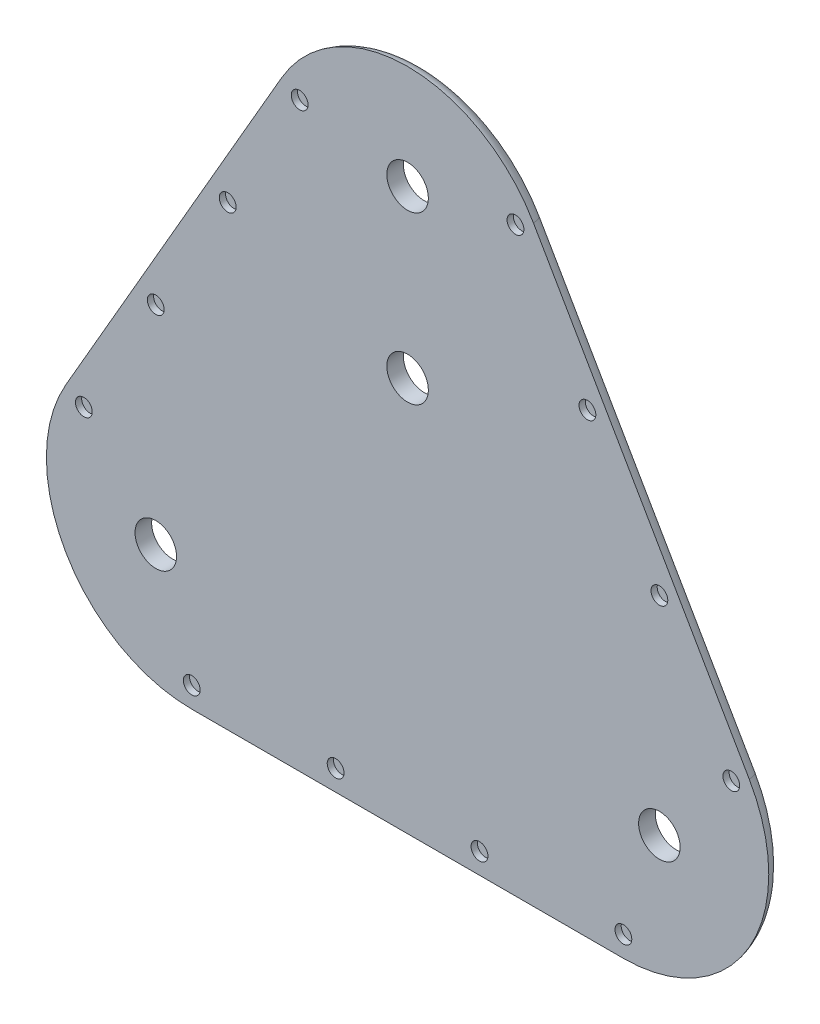
ISO-10303-21;
HEADER;
FILE_DESCRIPTION(('STEP AP214'),'2;1');
FILE_NAME('part.step','',(''),(''),'','','');
FILE_SCHEMA(('AUTOMOTIVE_DESIGN { 1 0 10303 214 1 1 1 1 }'));
ENDSEC;
DATA;
#1=APPLICATION_CONTEXT('core data for automotive mechanical design processes');
#2=APPLICATION_PROTOCOL_DEFINITION('international standard','automotive_design',2000,#1);
#3=PRODUCT_CONTEXT('',#1,'mechanical');
#4=PRODUCT('Part','Part','',(#3));
#5=PRODUCT_RELATED_PRODUCT_CATEGORY('part','',(#4));
#6=PRODUCT_DEFINITION_FORMATION('','',#4);
#7=PRODUCT_DEFINITION_CONTEXT('part definition',#1,'design');
#8=PRODUCT_DEFINITION('design','',#6,#7);
#9=PRODUCT_DEFINITION_SHAPE('','',#8);
#10=(LENGTH_UNIT() NAMED_UNIT(*) SI_UNIT(.MILLI.,.METRE.));
#11=(NAMED_UNIT(*) PLANE_ANGLE_UNIT() SI_UNIT($,.RADIAN.));
#12=(NAMED_UNIT(*) SI_UNIT($,.STERADIAN.) SOLID_ANGLE_UNIT());
#13=UNCERTAINTY_MEASURE_WITH_UNIT(LENGTH_MEASURE(1.E-05),#10,'distance_accuracy_value','');
#14=(GEOMETRIC_REPRESENTATION_CONTEXT(3) GLOBAL_UNCERTAINTY_ASSIGNED_CONTEXT((#13)) GLOBAL_UNIT_ASSIGNED_CONTEXT((#10,
#11,#12)) REPRESENTATION_CONTEXT('',''));
#15=CARTESIAN_POINT('',(0.,0.,0.));
#16=DIRECTION('',(0.,0.,1.));
#17=DIRECTION('',(1.,0.,0.));
#18=AXIS2_PLACEMENT_3D('',#15,#16,#17);
#19=CARTESIAN_POINT('',(0.,60.,4.));
#20=DIRECTION('',(0.,0.,1.));
#21=DIRECTION('',(1.,0.,0.));
#22=AXIS2_PLACEMENT_3D('',#19,#20,#21);
#23=PLANE('',#22);
#24=CARTESIAN_POINT('',(-77.9422863405994,-15.0000000000003,4.));
#25=DIRECTION('',(0.,0.,1.));
#26=DIRECTION('',(1.,0.,0.));
#27=AXIS2_PLACEMENT_3D('',#24,#25,#26);
#28=CIRCLE('',#27,2.025);
#29=CARTESIAN_POINT('',(-75.9172863405994,-15.0000000000003,4.));
#30=VERTEX_POINT('',#29);
#31=EDGE_CURVE('E216',#30,#30,#28,.T.);
#32=ORIENTED_EDGE('',*,*,#31,.F.);
#33=EDGE_LOOP('',(#32));
#34=FACE_BOUND('',#33,.T.);
#35=CARTESIAN_POINT('',(51.958475772934,-60.0000000000003,4.));
#36=DIRECTION('',(0.,0.,1.));
#37=DIRECTION('',(1.,0.,0.));
#38=AXIS2_PLACEMENT_3D('',#35,#36,#37);
#39=CIRCLE('',#38,2.025);
#40=CARTESIAN_POINT('',(53.983475772934,-60.0000000000003,4.));
#41=VERTEX_POINT('',#40);
#42=EDGE_CURVE('E165',#41,#41,#39,.T.);
#43=ORIENTED_EDGE('',*,*,#42,.F.);
#44=EDGE_LOOP('',(#43));
#45=FACE_BOUND('',#44,.T.);
#46=CARTESIAN_POINT('',(17.318475772934,-60.0000000000003,4.));
#47=DIRECTION('',(0.,0.,1.));
#48=DIRECTION('',(1.,0.,0.));
#49=AXIS2_PLACEMENT_3D('',#46,#47,#48);
#50=CIRCLE('',#49,2.025);
#51=CARTESIAN_POINT('',(19.343475772934,-60.0000000000003,4.));
#52=VERTEX_POINT('',#51);
#53=EDGE_CURVE('E174',#52,#52,#50,.T.);
#54=ORIENTED_EDGE('',*,*,#53,.F.);
#55=EDGE_LOOP('',(#54));
#56=FACE_BOUND('',#55,.T.);
#57=CARTESIAN_POINT('',(-17.321524227066,-60.0000000000002,4.));
#58=DIRECTION('',(0.,0.,1.));
#59=DIRECTION('',(1.,0.,0.));
#60=AXIS2_PLACEMENT_3D('',#57,#58,#59);
#61=CIRCLE('',#60,2.025);
#62=CARTESIAN_POINT('',(-15.296524227066,-60.0000000000002,4.));
#63=VERTEX_POINT('',#62);
#64=EDGE_CURVE('E450',#63,#63,#61,.T.);
#65=ORIENTED_EDGE('',*,*,#64,.F.);
#66=EDGE_LOOP('',(#65));
#67=FACE_BOUND('',#66,.T.);
#68=CARTESIAN_POINT('',(-51.961524227066,-60.0000000000002,4.));
#69=DIRECTION('',(0.,0.,1.));
#70=DIRECTION('',(1.,0.,0.));
#71=AXIS2_PLACEMENT_3D('',#68,#69,#70);
#72=CIRCLE('',#71,2.025);
#73=CARTESIAN_POINT('',(-49.936524227066,-60.0000000000002,4.));
#74=VERTEX_POINT('',#73);
#75=EDGE_CURVE('E217',#74,#74,#72,.T.);
#76=ORIENTED_EDGE('',*,*,#75,.F.);
#77=EDGE_LOOP('',(#76));
#78=FACE_BOUND('',#77,.T.);
#79=CARTESIAN_POINT('',(77.9422863405997,-14.9999999999994,4.));
#80=DIRECTION('',(0.,0.,1.));
#81=DIRECTION('',(1.,0.,0.));
#82=AXIS2_PLACEMENT_3D('',#79,#80,#81);
#83=CIRCLE('',#82,2.02499999999999);
#84=CARTESIAN_POINT('',(79.9672863405997,-14.9999999999994,4.));
#85=VERTEX_POINT('',#84);
#86=EDGE_CURVE('E225',#85,#85,#83,.T.);
#87=ORIENTED_EDGE('',*,*,#86,.F.);
#88=EDGE_LOOP('',(#87));
#89=FACE_BOUND('',#88,.T.);
#90=CARTESIAN_POINT('',(-60.6222863405994,14.9991199870927,4.));
#91=DIRECTION('',(0.,0.,1.));
#92=DIRECTION('',(1.,0.,0.));
#93=AXIS2_PLACEMENT_3D('',#90,#91,#92);
#94=CIRCLE('',#93,2.025);
#95=CARTESIAN_POINT('',(-58.5972863405994,14.9991199870927,4.));
#96=VERTEX_POINT('',#95);
#97=EDGE_CURVE('E233',#96,#96,#94,.T.);
#98=ORIENTED_EDGE('',*,*,#97,.F.);
#99=EDGE_LOOP('',(#98));
#100=FACE_BOUND('',#99,.T.);
#101=CARTESIAN_POINT('',(-43.3022863405995,44.9982399741857,4.));
#102=DIRECTION('',(0.,0.,1.));
#103=DIRECTION('',(1.,0.,0.));
#104=AXIS2_PLACEMENT_3D('',#101,#102,#103);
#105=CIRCLE('',#104,2.02499999999999);
#106=CARTESIAN_POINT('',(-41.2772863405995,44.9982399741857,4.));
#107=VERTEX_POINT('',#106);
#108=EDGE_CURVE('E200',#107,#107,#105,.T.);
#109=ORIENTED_EDGE('',*,*,#108,.F.);
#110=EDGE_LOOP('',(#109));
#111=FACE_BOUND('',#110,.T.);
#112=CARTESIAN_POINT('',(25.9822863405993,74.9973599612792,4.));
#113=DIRECTION('',(0.,0.,1.));
#114=DIRECTION('',(1.,0.,0.));
#115=AXIS2_PLACEMENT_3D('',#112,#113,#114);
#116=CIRCLE('',#115,2.02499999999999);
#117=CARTESIAN_POINT('',(28.0072863405993,74.9973599612792,4.));
#118=VERTEX_POINT('',#117);
#119=EDGE_CURVE('E191',#118,#118,#116,.T.);
#120=ORIENTED_EDGE('',*,*,#119,.F.);
#121=EDGE_LOOP('',(#120));
#122=FACE_BOUND('',#121,.T.);
#123=CARTESIAN_POINT('',(43.3022863405994,44.9982399741863,4.));
#124=DIRECTION('',(0.,0.,1.));
#125=DIRECTION('',(1.,0.,0.));
#126=AXIS2_PLACEMENT_3D('',#123,#124,#125);
#127=CIRCLE('',#126,2.02499999999999);
#128=CARTESIAN_POINT('',(45.3272863405994,44.9982399741863,4.));
#129=VERTEX_POINT('',#128);
#130=EDGE_CURVE('E183',#129,#129,#127,.T.);
#131=ORIENTED_EDGE('',*,*,#130,.F.);
#132=EDGE_LOOP('',(#131));
#133=FACE_BOUND('',#132,.T.);
#134=CARTESIAN_POINT('',(60.6222863405996,14.9991199870935,4.));
#135=DIRECTION('',(0.,0.,1.));
#136=DIRECTION('',(1.,0.,0.));
#137=AXIS2_PLACEMENT_3D('',#134,#135,#136);
#138=CIRCLE('',#137,2.02499999999999);
#139=CARTESIAN_POINT('',(62.6472863405996,14.9991199870935,4.));
#140=VERTEX_POINT('',#139);
#141=EDGE_CURVE('E182',#140,#140,#138,.T.);
#142=ORIENTED_EDGE('',*,*,#141,.F.);
#143=EDGE_LOOP('',(#142));
#144=FACE_BOUND('',#143,.T.);
#145=CARTESIAN_POINT('',(-25.9822863405996,74.9973599612787,4.));
#146=DIRECTION('',(0.,0.,1.));
#147=DIRECTION('',(1.,0.,0.));
#148=AXIS2_PLACEMENT_3D('',#145,#146,#147);
#149=CIRCLE('',#148,2.02499999999999);
#150=CARTESIAN_POINT('',(-23.9572863405996,74.9973599612787,4.));
#151=VERTEX_POINT('',#150);
#152=EDGE_CURVE('E201',#151,#151,#149,.T.);
#153=ORIENTED_EDGE('',*,*,#152,.F.);
#154=EDGE_LOOP('',(#153));
#155=FACE_BOUND('',#154,.T.);
#156=CARTESIAN_POINT('',(0.,70.,4.));
#157=DIRECTION('',(0.,0.,1.));
#158=DIRECTION('',(1.,0.,0.));
#159=AXIS2_PLACEMENT_3D('',#156,#157,#158);
#160=CIRCLE('',#159,5.);
#161=CARTESIAN_POINT('',(5.,70.,4.));
#162=VERTEX_POINT('',#161);
#163=EDGE_CURVE('E111',#162,#162,#160,.T.);
#164=ORIENTED_EDGE('',*,*,#163,.F.);
#165=EDGE_LOOP('',(#164));
#166=FACE_BOUND('',#165,.T.);
#167=CARTESIAN_POINT('',(0.,30.,4.));
#168=DIRECTION('',(0.,0.,1.));
#169=DIRECTION('',(1.,0.,0.));
#170=AXIS2_PLACEMENT_3D('',#167,#168,#169);
#171=CIRCLE('',#170,5.);
#172=CARTESIAN_POINT('',(5.,30.,4.));
#173=VERTEX_POINT('',#172);
#174=EDGE_CURVE('E248',#173,#173,#171,.T.);
#175=ORIENTED_EDGE('',*,*,#174,.F.);
#176=EDGE_LOOP('',(#175));
#177=FACE_BOUND('',#176,.T.);
#178=CARTESIAN_POINT('',(60.6217782649152,-34.9999999999974,4.));
#179=DIRECTION('',(0.,0.,1.));
#180=DIRECTION('',(1.,0.,0.));
#181=AXIS2_PLACEMENT_3D('',#178,#179,#180);
#182=CIRCLE('',#181,5.00000000000382);
#183=CARTESIAN_POINT('',(65.621778264919,-34.9999999999974,4.));
#184=VERTEX_POINT('',#183);
#185=EDGE_CURVE('E256',#184,#184,#182,.T.);
#186=ORIENTED_EDGE('',*,*,#185,.F.);
#187=EDGE_LOOP('',(#186));
#188=FACE_BOUND('',#187,.T.);
#189=CARTESIAN_POINT('',(-60.6217782649063,-35.0000000000026,4.));
#190=DIRECTION('',(0.,0.,1.));
#191=DIRECTION('',(1.,0.,0.));
#192=AXIS2_PLACEMENT_3D('',#189,#190,#191);
#193=CIRCLE('',#192,5.00000000000564);
#194=CARTESIAN_POINT('',(-55.6217782649006,-35.0000000000026,4.));
#195=VERTEX_POINT('',#194);
#196=EDGE_CURVE('E264',#195,#195,#193,.T.);
#197=ORIENTED_EDGE('',*,*,#196,.F.);
#198=EDGE_LOOP('',(#197));
#199=FACE_BOUND('',#198,.T.);
#200=CARTESIAN_POINT('',(0.,60.,4.));
#201=DIRECTION('',(0.,0.,1.));
#202=DIRECTION('',(1.,0.,0.));
#203=AXIS2_PLACEMENT_3D('',#200,#201,#202);
#204=CIRCLE('',#203,35.);
#205=CARTESIAN_POINT('',(30.3108891324553,77.5000000000001,4.));
#206=VERTEX_POINT('',#205);
#207=CARTESIAN_POINT('',(-30.3108891324554,77.4999999999999,4.));
#208=VERTEX_POINT('',#207);
#209=EDGE_CURVE('E100',#206,#208,#204,.T.);
#210=ORIENTED_EDGE('',*,*,#209,.T.);
#211=DIRECTION('',(-0.499999999999998,-0.86602540378444,0.));
#212=VECTOR('',#211,1.);
#213=CARTESIAN_POINT('',(-30.3108891324554,77.4999999999999,4.));
#214=LINE('',#213,#212);
#215=CARTESIAN_POINT('',(-82.2724133595216,-12.5000000000003,4.));
#216=VERTEX_POINT('',#215);
#217=EDGE_CURVE('E104',#208,#216,#214,.T.);
#218=ORIENTED_EDGE('',*,*,#217,.T.);
#219=CARTESIAN_POINT('',(-51.9615242270662,-30.0000000000002,4.));
#220=DIRECTION('',(0.,0.,1.));
#221=DIRECTION('',(1.,0.,0.));
#222=AXIS2_PLACEMENT_3D('',#219,#220,#221);
#223=CIRCLE('',#222,35.);
#224=CARTESIAN_POINT('',(-51.9615242270659,-65.0000000000003,4.));
#225=VERTEX_POINT('',#224);
#226=EDGE_CURVE('E124',#216,#225,#223,.T.);
#227=ORIENTED_EDGE('',*,*,#226,.T.);
#228=DIRECTION('',(1.,0.,0.));
#229=VECTOR('',#228,1.);
#230=CARTESIAN_POINT('',(-51.9615242270659,-65.0000000000003,4.));
#231=LINE('',#230,#229);
#232=CARTESIAN_POINT('',(51.9615242270668,-64.9999999999995,4.));
#233=VERTEX_POINT('',#232);
#234=EDGE_CURVE('E127',#225,#233,#231,.T.);
#235=ORIENTED_EDGE('',*,*,#234,.T.);
#236=CARTESIAN_POINT('',(51.9615242270666,-29.9999999999995,4.));
#237=DIRECTION('',(0.,0.,1.));
#238=DIRECTION('',(1.,0.,0.));
#239=AXIS2_PLACEMENT_3D('',#236,#237,#238);
#240=CIRCLE('',#239,35.);
#241=CARTESIAN_POINT('',(82.2724133595219,-12.4999999999994,4.));
#242=VERTEX_POINT('',#241);
#243=EDGE_CURVE('E133',#233,#242,#240,.T.);
#244=ORIENTED_EDGE('',*,*,#243,.T.);
#245=DIRECTION('',(-0.500000000000004,0.866025403784436,0.));
#246=VECTOR('',#245,1.);
#247=CARTESIAN_POINT('',(82.2724133595219,-12.4999999999994,4.));
#248=LINE('',#247,#246);
#249=EDGE_CURVE('E106',#242,#206,#248,.T.);
#250=ORIENTED_EDGE('',*,*,#249,.T.);
#251=EDGE_LOOP('',(#210,#218,#227,#235,#244,#250));
#252=FACE_BOUND('',#251,.T.);
#253=ADVANCED_FACE('F45',(#34,#45,#56,#67,#78,#89,#100,#111,#122,#133,#144,#155,#166,#177,#188,
#199,#252),#23,.T.);
#254=CARTESIAN_POINT('',(0.,60.,0.));
#255=DIRECTION('',(0.,0.,1.));
#256=DIRECTION('',(1.,0.,0.));
#257=AXIS2_PLACEMENT_3D('',#254,#255,#256);
#258=PLANE('',#257);
#259=DIRECTION('',(1.,0.,0.));
#260=VECTOR('',#259,1.);
#261=CARTESIAN_POINT('',(8.3398532044332E-13,-60.1010205144335,0.));
#262=LINE('',#261,#260);
#263=CARTESIAN_POINT('',(51.9615242270668,-60.1010205144332,0.));
#264=VERTEX_POINT('',#263);
#265=CARTESIAN_POINT('',(-51.961524227066,-60.1010205144339,0.));
#266=VERTEX_POINT('',#265);
#267=EDGE_CURVE('E138',#264,#266,#262,.F.);
#268=ORIENTED_EDGE('',*,*,#267,.T.);
#269=CARTESIAN_POINT('',(-51.9615242270662,-30.0000000000002,0.));
#270=DIRECTION('',(0.,0.,1.));
#271=DIRECTION('',(1.,0.,0.));
#272=AXIS2_PLACEMENT_3D('',#269,#270,#271);
#273=CIRCLE('',#272,30.1010205144336);
#274=CARTESIAN_POINT('',(-78.0297726724023,-14.9494897427835,0.));
#275=VERTEX_POINT('',#274);
#276=EDGE_CURVE('E11',#266,#275,#273,.F.);
#277=ORIENTED_EDGE('',*,*,#276,.T.);
#278=DIRECTION('',(-0.499999999999998,-0.86602540378444,0.));
#279=VECTOR('',#278,1.);
#280=CARTESIAN_POINT('',(-26.0682484453361,75.0505102572168,0.));
#281=LINE('',#280,#279);
#282=CARTESIAN_POINT('',(-26.0682484453361,75.0505102572168,0.));
#283=VERTEX_POINT('',#282);
#284=EDGE_CURVE('E55',#275,#283,#281,.F.);
#285=ORIENTED_EDGE('',*,*,#284,.T.);
#286=CARTESIAN_POINT('',(0.,60.,0.));
#287=DIRECTION('',(0.,0.,1.));
#288=DIRECTION('',(1.,0.,0.));
#289=AXIS2_PLACEMENT_3D('',#286,#287,#288);
#290=CIRCLE('',#289,30.1010205144336);
#291=CARTESIAN_POINT('',(26.068248445336,75.0505102572169,0.));
#292=VERTEX_POINT('',#291);
#293=EDGE_CURVE('E116',#283,#292,#290,.F.);
#294=ORIENTED_EDGE('',*,*,#293,.T.);
#295=DIRECTION('',(-0.500000000000004,0.866025403784436,0.));
#296=VECTOR('',#295,1.);
#297=CARTESIAN_POINT('',(26.068248445336,75.0505102572169,0.));
#298=LINE('',#297,#296);
#299=CARTESIAN_POINT('',(78.0297726724026,-14.9494897427826,0.));
#300=VERTEX_POINT('',#299);
#301=EDGE_CURVE('E144',#292,#300,#298,.F.);
#302=ORIENTED_EDGE('',*,*,#301,.T.);
#303=CARTESIAN_POINT('',(51.9615242270666,-29.9999999999995,0.));
#304=DIRECTION('',(0.,0.,1.));
#305=DIRECTION('',(1.,0.,0.));
#306=AXIS2_PLACEMENT_3D('',#303,#304,#305);
#307=CIRCLE('',#306,30.1010205144337);
#308=EDGE_CURVE('E141',#300,#264,#307,.F.);
#309=ORIENTED_EDGE('',*,*,#308,.T.);
#310=EDGE_LOOP('',(#268,#277,#285,#294,#302,#309));
#311=FACE_BOUND('',#310,.T.);
#312=CARTESIAN_POINT('',(0.,70.,0.));
#313=DIRECTION('',(0.,0.,1.));
#314=DIRECTION('',(1.,0.,0.));
#315=AXIS2_PLACEMENT_3D('',#312,#313,#314);
#316=CIRCLE('',#315,5.);
#317=CARTESIAN_POINT('',(5.,70.,0.));
#318=VERTEX_POINT('',#317);
#319=EDGE_CURVE('E244',#318,#318,#316,.T.);
#320=ORIENTED_EDGE('',*,*,#319,.T.);
#321=EDGE_LOOP('',(#320));
#322=FACE_BOUND('',#321,.T.);
#323=CARTESIAN_POINT('',(0.,30.,0.));
#324=DIRECTION('',(0.,0.,1.));
#325=DIRECTION('',(1.,0.,0.));
#326=AXIS2_PLACEMENT_3D('',#323,#324,#325);
#327=CIRCLE('',#326,5.);
#328=CARTESIAN_POINT('',(5.,30.,0.));
#329=VERTEX_POINT('',#328);
#330=EDGE_CURVE('E252',#329,#329,#327,.T.);
#331=ORIENTED_EDGE('',*,*,#330,.T.);
#332=EDGE_LOOP('',(#331));
#333=FACE_BOUND('',#332,.T.);
#334=CARTESIAN_POINT('',(60.6217782649152,-34.9999999999974,0.));
#335=DIRECTION('',(0.,0.,1.));
#336=DIRECTION('',(1.,0.,0.));
#337=AXIS2_PLACEMENT_3D('',#334,#335,#336);
#338=CIRCLE('',#337,5.00000000000382);
#339=CARTESIAN_POINT('',(65.621778264919,-34.9999999999974,0.));
#340=VERTEX_POINT('',#339);
#341=EDGE_CURVE('E260',#340,#340,#338,.T.);
#342=ORIENTED_EDGE('',*,*,#341,.T.);
#343=EDGE_LOOP('',(#342));
#344=FACE_BOUND('',#343,.T.);
#345=CARTESIAN_POINT('',(-60.6217782649063,-35.0000000000026,0.));
#346=DIRECTION('',(0.,0.,1.));
#347=DIRECTION('',(1.,0.,0.));
#348=AXIS2_PLACEMENT_3D('',#345,#346,#347);
#349=CIRCLE('',#348,5.00000000000564);
#350=CARTESIAN_POINT('',(-55.6217782649006,-35.0000000000026,0.));
#351=VERTEX_POINT('',#350);
#352=EDGE_CURVE('E268',#351,#351,#349,.T.);
#353=ORIENTED_EDGE('',*,*,#352,.T.);
#354=EDGE_LOOP('',(#353));
#355=FACE_BOUND('',#354,.T.);
#356=ADVANCED_FACE('F279',(#311,#322,#333,#344,#355),#258,.F.);
#357=CARTESIAN_POINT('',(-60.6217782649063,-35.0000000000026,18.1421356237469));
#358=DIRECTION('',(0.,0.,-1.));
#359=DIRECTION('',(-1.,0.,0.));
#360=AXIS2_PLACEMENT_3D('',#357,#358,#359);
#361=CYLINDRICAL_SURFACE('',#360,5.00000000000564);
#362=ORIENTED_EDGE('',*,*,#352,.F.);
#363=EDGE_LOOP('',(#362));
#364=FACE_BOUND('',#363,.T.);
#365=ORIENTED_EDGE('',*,*,#196,.T.);
#366=EDGE_LOOP('',(#365));
#367=FACE_BOUND('',#366,.T.);
#368=ADVANCED_FACE('F276',(#364,#367),#361,.F.);
#369=CARTESIAN_POINT('',(60.6217782649152,-34.9999999999974,18.1421356237469));
#370=DIRECTION('',(0.,0.,-1.));
#371=DIRECTION('',(-1.,0.,0.));
#372=AXIS2_PLACEMENT_3D('',#369,#370,#371);
#373=CYLINDRICAL_SURFACE('',#372,5.00000000000382);
#374=ORIENTED_EDGE('',*,*,#341,.F.);
#375=EDGE_LOOP('',(#374));
#376=FACE_BOUND('',#375,.T.);
#377=ORIENTED_EDGE('',*,*,#185,.T.);
#378=EDGE_LOOP('',(#377));
#379=FACE_BOUND('',#378,.T.);
#380=ADVANCED_FACE('F329',(#376,#379),#373,.F.);
#381=CARTESIAN_POINT('',(0.,30.,18.1421356237469));
#382=DIRECTION('',(0.,0.,-1.));
#383=DIRECTION('',(-1.,0.,0.));
#384=AXIS2_PLACEMENT_3D('',#381,#382,#383);
#385=CYLINDRICAL_SURFACE('',#384,5.);
#386=ORIENTED_EDGE('',*,*,#330,.F.);
#387=EDGE_LOOP('',(#386));
#388=FACE_BOUND('',#387,.T.);
#389=ORIENTED_EDGE('',*,*,#174,.T.);
#390=EDGE_LOOP('',(#389));
#391=FACE_BOUND('',#390,.T.);
#392=ADVANCED_FACE('F333',(#388,#391),#385,.F.);
#393=CARTESIAN_POINT('',(0.,70.,18.1421356237469));
#394=DIRECTION('',(0.,0.,-1.));
#395=DIRECTION('',(-1.,0.,0.));
#396=AXIS2_PLACEMENT_3D('',#393,#394,#395);
#397=CYLINDRICAL_SURFACE('',#396,5.);
#398=ORIENTED_EDGE('',*,*,#319,.F.);
#399=EDGE_LOOP('',(#398));
#400=FACE_BOUND('',#399,.T.);
#401=ORIENTED_EDGE('',*,*,#163,.T.);
#402=EDGE_LOOP('',(#401));
#403=FACE_BOUND('',#402,.T.);
#404=ADVANCED_FACE('F338',(#400,#403),#397,.F.);
#405=CARTESIAN_POINT('',(-25.9822863405996,74.9973599612787,2.5));
#406=DIRECTION('',(0.,0.,1.));
#407=DIRECTION('',(1.,0.,0.));
#408=AXIS2_PLACEMENT_3D('',#405,#406,#407);
#409=CYLINDRICAL_SURFACE('',#408,2.02499999999999);
#410=CARTESIAN_POINT('',(-25.9822863405996,74.9973599612787,2.5));
#411=DIRECTION('',(0.,0.,1.));
#412=DIRECTION('',(1.,0.,0.));
#413=AXIS2_PLACEMENT_3D('',#410,#411,#412);
#414=CIRCLE('',#413,2.02499999999999);
#415=CARTESIAN_POINT('',(-23.9572863405996,74.9973599612787,2.5));
#416=VERTEX_POINT('',#415);
#417=EDGE_CURVE('E196',#416,#416,#414,.T.);
#418=ORIENTED_EDGE('',*,*,#417,.F.);
#419=EDGE_LOOP('',(#418));
#420=FACE_BOUND('',#419,.T.);
#421=ORIENTED_EDGE('',*,*,#152,.T.);
#422=EDGE_LOOP('',(#421));
#423=FACE_BOUND('',#422,.T.);
#424=ADVANCED_FACE('F345',(#420,#423),#409,.F.);
#425=CARTESIAN_POINT('',(-25.9822863405996,74.9973599612787,2.5));
#426=DIRECTION('',(0.,0.,1.));
#427=DIRECTION('',(1.,0.,0.));
#428=AXIS2_PLACEMENT_3D('',#425,#426,#427);
#429=PLANE('',#428);
#430=ORIENTED_EDGE('',*,*,#417,.T.);
#431=EDGE_LOOP('',(#430));
#432=FACE_BOUND('',#431,.T.);
#433=ADVANCED_FACE('F385',(#432),#429,.T.);
#434=CARTESIAN_POINT('',(60.6222863405996,14.9991199870935,2.5));
#435=DIRECTION('',(0.,0.,1.));
#436=DIRECTION('',(1.,0.,0.));
#437=AXIS2_PLACEMENT_3D('',#434,#435,#436);
#438=CYLINDRICAL_SURFACE('',#437,2.02499999999999);
#439=CARTESIAN_POINT('',(60.6222863405996,14.9991199870935,2.5));
#440=DIRECTION('',(0.,0.,1.));
#441=DIRECTION('',(1.,0.,0.));
#442=AXIS2_PLACEMENT_3D('',#439,#440,#441);
#443=CIRCLE('',#442,2.02499999999999);
#444=CARTESIAN_POINT('',(62.6472863405996,14.9991199870935,2.5));
#445=VERTEX_POINT('',#444);
#446=EDGE_CURVE('E205',#445,#445,#443,.T.);
#447=ORIENTED_EDGE('',*,*,#446,.F.);
#448=EDGE_LOOP('',(#447));
#449=FACE_BOUND('',#448,.T.);
#450=ORIENTED_EDGE('',*,*,#141,.T.);
#451=EDGE_LOOP('',(#450));
#452=FACE_BOUND('',#451,.T.);
#453=ADVANCED_FACE('F381',(#449,#452),#438,.F.);
#454=CARTESIAN_POINT('',(60.6222863405996,14.9991199870935,2.5));
#455=DIRECTION('',(0.,0.,1.));
#456=DIRECTION('',(1.,0.,0.));
#457=AXIS2_PLACEMENT_3D('',#454,#455,#456);
#458=PLANE('',#457);
#459=ORIENTED_EDGE('',*,*,#446,.T.);
#460=EDGE_LOOP('',(#459));
#461=FACE_BOUND('',#460,.T.);
#462=ADVANCED_FACE('F384',(#461),#458,.T.);
#463=CARTESIAN_POINT('',(43.3022863405994,44.9982399741863,2.5));
#464=DIRECTION('',(0.,0.,1.));
#465=DIRECTION('',(1.,0.,0.));
#466=AXIS2_PLACEMENT_3D('',#463,#464,#465);
#467=CYLINDRICAL_SURFACE('',#466,2.02499999999999);
#468=CARTESIAN_POINT('',(43.3022863405994,44.9982399741863,2.5));
#469=DIRECTION('',(0.,0.,1.));
#470=DIRECTION('',(1.,0.,0.));
#471=AXIS2_PLACEMENT_3D('',#468,#469,#470);
#472=CIRCLE('',#471,2.02499999999999);
#473=CARTESIAN_POINT('',(45.3272863405994,44.9982399741863,2.5));
#474=VERTEX_POINT('',#473);
#475=EDGE_CURVE('E178',#474,#474,#472,.T.);
#476=ORIENTED_EDGE('',*,*,#475,.F.);
#477=EDGE_LOOP('',(#476));
#478=FACE_BOUND('',#477,.T.);
#479=ORIENTED_EDGE('',*,*,#130,.T.);
#480=EDGE_LOOP('',(#479));
#481=FACE_BOUND('',#480,.T.);
#482=ADVANCED_FACE('F389',(#478,#481),#467,.F.);
#483=CARTESIAN_POINT('',(43.3022863405994,44.9982399741863,2.5));
#484=DIRECTION('',(0.,0.,1.));
#485=DIRECTION('',(1.,0.,0.));
#486=AXIS2_PLACEMENT_3D('',#483,#484,#485);
#487=PLANE('',#486);
#488=ORIENTED_EDGE('',*,*,#475,.T.);
#489=EDGE_LOOP('',(#488));
#490=FACE_BOUND('',#489,.T.);
#491=ADVANCED_FACE('F400',(#490),#487,.T.);
#492=CARTESIAN_POINT('',(25.9822863405993,74.9973599612792,2.5));
#493=DIRECTION('',(0.,0.,1.));
#494=DIRECTION('',(1.,0.,0.));
#495=AXIS2_PLACEMENT_3D('',#492,#493,#494);
#496=CYLINDRICAL_SURFACE('',#495,2.02499999999999);
#497=CARTESIAN_POINT('',(25.9822863405993,74.9973599612792,2.5));
#498=DIRECTION('',(0.,0.,1.));
#499=DIRECTION('',(1.,0.,0.));
#500=AXIS2_PLACEMENT_3D('',#497,#498,#499);
#501=CIRCLE('',#500,2.02499999999999);
#502=CARTESIAN_POINT('',(28.0072863405993,74.9973599612792,2.5));
#503=VERTEX_POINT('',#502);
#504=EDGE_CURVE('E187',#503,#503,#501,.T.);
#505=ORIENTED_EDGE('',*,*,#504,.F.);
#506=EDGE_LOOP('',(#505));
#507=FACE_BOUND('',#506,.T.);
#508=ORIENTED_EDGE('',*,*,#119,.T.);
#509=EDGE_LOOP('',(#508));
#510=FACE_BOUND('',#509,.T.);
#511=ADVANCED_FACE('F397',(#507,#510),#496,.F.);
#512=CARTESIAN_POINT('',(25.9822863405993,74.9973599612792,2.5));
#513=DIRECTION('',(0.,0.,1.));
#514=DIRECTION('',(1.,0.,0.));
#515=AXIS2_PLACEMENT_3D('',#512,#513,#514);
#516=PLANE('',#515);
#517=ORIENTED_EDGE('',*,*,#504,.T.);
#518=EDGE_LOOP('',(#517));
#519=FACE_BOUND('',#518,.T.);
#520=ADVANCED_FACE('F351',(#519),#516,.T.);
#521=CARTESIAN_POINT('',(-43.3022863405995,44.9982399741857,2.5));
#522=DIRECTION('',(0.,0.,1.));
#523=DIRECTION('',(1.,0.,0.));
#524=AXIS2_PLACEMENT_3D('',#521,#522,#523);
#525=CYLINDRICAL_SURFACE('',#524,2.02499999999999);
#526=CARTESIAN_POINT('',(-43.3022863405995,44.9982399741857,2.5));
#527=DIRECTION('',(0.,0.,1.));
#528=DIRECTION('',(1.,0.,0.));
#529=AXIS2_PLACEMENT_3D('',#526,#527,#528);
#530=CIRCLE('',#529,2.02499999999999);
#531=CARTESIAN_POINT('',(-41.2772863405995,44.9982399741857,2.5));
#532=VERTEX_POINT('',#531);
#533=EDGE_CURVE('E237',#532,#532,#530,.T.);
#534=ORIENTED_EDGE('',*,*,#533,.F.);
#535=EDGE_LOOP('',(#534));
#536=FACE_BOUND('',#535,.T.);
#537=ORIENTED_EDGE('',*,*,#108,.T.);
#538=EDGE_LOOP('',(#537));
#539=FACE_BOUND('',#538,.T.);
#540=ADVANCED_FACE('F347',(#536,#539),#525,.F.);
#541=CARTESIAN_POINT('',(-43.3022863405995,44.9982399741857,2.5));
#542=DIRECTION('',(0.,0.,1.));
#543=DIRECTION('',(1.,0.,0.));
#544=AXIS2_PLACEMENT_3D('',#541,#542,#543);
#545=PLANE('',#544);
#546=ORIENTED_EDGE('',*,*,#533,.T.);
#547=EDGE_LOOP('',(#546));
#548=FACE_BOUND('',#547,.T.);
#549=ADVANCED_FACE('F350',(#548),#545,.T.);
#550=CARTESIAN_POINT('',(-60.6222863405994,14.9991199870927,2.5));
#551=DIRECTION('',(0.,0.,1.));
#552=DIRECTION('',(1.,0.,0.));
#553=AXIS2_PLACEMENT_3D('',#550,#551,#552);
#554=CYLINDRICAL_SURFACE('',#553,2.025);
#555=CARTESIAN_POINT('',(-60.6222863405994,14.9991199870927,2.5));
#556=DIRECTION('',(0.,0.,1.));
#557=DIRECTION('',(1.,0.,0.));
#558=AXIS2_PLACEMENT_3D('',#555,#556,#557);
#559=CIRCLE('',#558,2.025);
#560=CARTESIAN_POINT('',(-58.5972863405994,14.9991199870927,2.5));
#561=VERTEX_POINT('',#560);
#562=EDGE_CURVE('E229',#561,#561,#559,.T.);
#563=ORIENTED_EDGE('',*,*,#562,.F.);
#564=EDGE_LOOP('',(#563));
#565=FACE_BOUND('',#564,.T.);
#566=ORIENTED_EDGE('',*,*,#97,.T.);
#567=EDGE_LOOP('',(#566));
#568=FACE_BOUND('',#567,.T.);
#569=ADVANCED_FACE('F355',(#565,#568),#554,.F.);
#570=CARTESIAN_POINT('',(-60.6222863405994,14.9991199870927,2.5));
#571=DIRECTION('',(0.,0.,1.));
#572=DIRECTION('',(1.,0.,0.));
#573=AXIS2_PLACEMENT_3D('',#570,#571,#572);
#574=PLANE('',#573);
#575=ORIENTED_EDGE('',*,*,#562,.T.);
#576=EDGE_LOOP('',(#575));
#577=FACE_BOUND('',#576,.T.);
#578=ADVANCED_FACE('F359',(#577),#574,.T.);
#579=CARTESIAN_POINT('',(77.9422863405997,-14.9999999999994,2.5));
#580=DIRECTION('',(0.,0.,1.));
#581=DIRECTION('',(1.,0.,0.));
#582=AXIS2_PLACEMENT_3D('',#579,#580,#581);
#583=CYLINDRICAL_SURFACE('',#582,2.02499999999999);
#584=CARTESIAN_POINT('',(77.9422863405997,-14.9999999999994,2.5));
#585=DIRECTION('',(0.,0.,1.));
#586=DIRECTION('',(1.,0.,0.));
#587=AXIS2_PLACEMENT_3D('',#584,#585,#586);
#588=CIRCLE('',#587,2.02499999999999);
#589=CARTESIAN_POINT('',(79.9672863405997,-14.9999999999994,2.5));
#590=VERTEX_POINT('',#589);
#591=EDGE_CURVE('E221',#590,#590,#588,.T.);
#592=ORIENTED_EDGE('',*,*,#591,.F.);
#593=EDGE_LOOP('',(#592));
#594=FACE_BOUND('',#593,.T.);
#595=ORIENTED_EDGE('',*,*,#86,.T.);
#596=EDGE_LOOP('',(#595));
#597=FACE_BOUND('',#596,.T.);
#598=ADVANCED_FACE('F363',(#594,#597),#583,.F.);
#599=CARTESIAN_POINT('',(77.9422863405997,-14.9999999999994,2.5));
#600=DIRECTION('',(0.,0.,1.));
#601=DIRECTION('',(1.,0.,0.));
#602=AXIS2_PLACEMENT_3D('',#599,#600,#601);
#603=PLANE('',#602);
#604=ORIENTED_EDGE('',*,*,#591,.T.);
#605=EDGE_LOOP('',(#604));
#606=FACE_BOUND('',#605,.T.);
#607=ADVANCED_FACE('F367',(#606),#603,.T.);
#608=CARTESIAN_POINT('',(-51.961524227066,-60.0000000000002,2.5));
#609=DIRECTION('',(0.,0.,1.));
#610=DIRECTION('',(1.,0.,0.));
#611=AXIS2_PLACEMENT_3D('',#608,#609,#610);
#612=CYLINDRICAL_SURFACE('',#611,2.025);
#613=CARTESIAN_POINT('',(-51.961524227066,-60.0000000000002,2.5));
#614=DIRECTION('',(0.,0.,1.));
#615=DIRECTION('',(1.,0.,0.));
#616=AXIS2_PLACEMENT_3D('',#613,#614,#615);
#617=CIRCLE('',#616,2.025);
#618=CARTESIAN_POINT('',(-49.936524227066,-60.0000000000002,2.5));
#619=VERTEX_POINT('',#618);
#620=EDGE_CURVE('E212',#619,#619,#617,.T.);
#621=ORIENTED_EDGE('',*,*,#620,.F.);
#622=EDGE_LOOP('',(#621));
#623=FACE_BOUND('',#622,.T.);
#624=ORIENTED_EDGE('',*,*,#75,.T.);
#625=EDGE_LOOP('',(#624));
#626=FACE_BOUND('',#625,.T.);
#627=ADVANCED_FACE('F371',(#623,#626),#612,.F.);
#628=CARTESIAN_POINT('',(-51.961524227066,-60.0000000000002,2.5));
#629=DIRECTION('',(0.,0.,1.));
#630=DIRECTION('',(1.,0.,0.));
#631=AXIS2_PLACEMENT_3D('',#628,#629,#630);
#632=PLANE('',#631);
#633=ORIENTED_EDGE('',*,*,#620,.T.);
#634=EDGE_LOOP('',(#633));
#635=FACE_BOUND('',#634,.T.);
#636=ADVANCED_FACE('F375',(#635),#632,.T.);
#637=CARTESIAN_POINT('',(-17.321524227066,-60.0000000000002,2.5));
#638=DIRECTION('',(0.,0.,1.));
#639=DIRECTION('',(1.,0.,0.));
#640=AXIS2_PLACEMENT_3D('',#637,#638,#639);
#641=CYLINDRICAL_SURFACE('',#640,2.025);
#642=CARTESIAN_POINT('',(-17.321524227066,-60.0000000000002,2.5));
#643=DIRECTION('',(0.,0.,1.));
#644=DIRECTION('',(1.,0.,0.));
#645=AXIS2_PLACEMENT_3D('',#642,#643,#644);
#646=CIRCLE('',#645,2.025);
#647=CARTESIAN_POINT('',(-15.296524227066,-60.0000000000002,2.5));
#648=VERTEX_POINT('',#647);
#649=EDGE_CURVE('E195',#648,#648,#646,.T.);
#650=ORIENTED_EDGE('',*,*,#649,.F.);
#651=EDGE_LOOP('',(#650));
#652=FACE_BOUND('',#651,.T.);
#653=ORIENTED_EDGE('',*,*,#64,.T.);
#654=EDGE_LOOP('',(#653));
#655=FACE_BOUND('',#654,.T.);
#656=ADVANCED_FACE('F379',(#652,#655),#641,.F.);
#657=CARTESIAN_POINT('',(-17.321524227066,-60.0000000000002,2.5));
#658=DIRECTION('',(0.,0.,1.));
#659=DIRECTION('',(1.,0.,0.));
#660=AXIS2_PLACEMENT_3D('',#657,#658,#659);
#661=PLANE('',#660);
#662=ORIENTED_EDGE('',*,*,#649,.T.);
#663=EDGE_LOOP('',(#662));
#664=FACE_BOUND('',#663,.T.);
#665=ADVANCED_FACE('F423',(#664),#661,.T.);
#666=CARTESIAN_POINT('',(17.318475772934,-60.0000000000003,2.5));
#667=DIRECTION('',(0.,0.,1.));
#668=DIRECTION('',(1.,0.,0.));
#669=AXIS2_PLACEMENT_3D('',#666,#667,#668);
#670=CYLINDRICAL_SURFACE('',#669,2.025);
#671=CARTESIAN_POINT('',(17.318475772934,-60.0000000000003,2.5));
#672=DIRECTION('',(0.,0.,1.));
#673=DIRECTION('',(1.,0.,0.));
#674=AXIS2_PLACEMENT_3D('',#671,#672,#673);
#675=CIRCLE('',#674,2.025);
#676=CARTESIAN_POINT('',(19.343475772934,-60.0000000000003,2.5));
#677=VERTEX_POINT('',#676);
#678=EDGE_CURVE('E454',#677,#677,#675,.T.);
#679=ORIENTED_EDGE('',*,*,#678,.F.);
#680=EDGE_LOOP('',(#679));
#681=FACE_BOUND('',#680,.T.);
#682=ORIENTED_EDGE('',*,*,#53,.T.);
#683=EDGE_LOOP('',(#682));
#684=FACE_BOUND('',#683,.T.);
#685=ADVANCED_FACE('F420',(#681,#684),#670,.F.);
#686=CARTESIAN_POINT('',(17.318475772934,-60.0000000000003,2.5));
#687=DIRECTION('',(0.,0.,1.));
#688=DIRECTION('',(1.,0.,0.));
#689=AXIS2_PLACEMENT_3D('',#686,#687,#688);
#690=PLANE('',#689);
#691=ORIENTED_EDGE('',*,*,#678,.T.);
#692=EDGE_LOOP('',(#691));
#693=FACE_BOUND('',#692,.T.);
#694=ADVANCED_FACE('F415',(#693),#690,.T.);
#695=CARTESIAN_POINT('',(51.958475772934,-60.0000000000003,2.5));
#696=DIRECTION('',(0.,0.,1.));
#697=DIRECTION('',(1.,0.,0.));
#698=AXIS2_PLACEMENT_3D('',#695,#696,#697);
#699=CYLINDRICAL_SURFACE('',#698,2.025);
#700=CARTESIAN_POINT('',(51.958475772934,-60.0000000000003,2.5));
#701=DIRECTION('',(0.,0.,1.));
#702=DIRECTION('',(1.,0.,0.));
#703=AXIS2_PLACEMENT_3D('',#700,#701,#702);
#704=CIRCLE('',#703,2.025);
#705=CARTESIAN_POINT('',(53.983475772934,-60.0000000000003,2.5));
#706=VERTEX_POINT('',#705);
#707=EDGE_CURVE('E168',#706,#706,#704,.T.);
#708=ORIENTED_EDGE('',*,*,#707,.F.);
#709=EDGE_LOOP('',(#708));
#710=FACE_BOUND('',#709,.T.);
#711=ORIENTED_EDGE('',*,*,#42,.T.);
#712=EDGE_LOOP('',(#711));
#713=FACE_BOUND('',#712,.T.);
#714=ADVANCED_FACE('F411',(#710,#713),#699,.F.);
#715=CARTESIAN_POINT('',(51.958475772934,-60.0000000000003,2.5));
#716=DIRECTION('',(0.,0.,1.));
#717=DIRECTION('',(1.,0.,0.));
#718=AXIS2_PLACEMENT_3D('',#715,#716,#717);
#719=PLANE('',#718);
#720=ORIENTED_EDGE('',*,*,#707,.T.);
#721=EDGE_LOOP('',(#720));
#722=FACE_BOUND('',#721,.T.);
#723=ADVANCED_FACE('F414',(#722),#719,.T.);
#724=CARTESIAN_POINT('',(-77.9422863405994,-15.0000000000003,2.5));
#725=DIRECTION('',(0.,0.,1.));
#726=DIRECTION('',(1.,0.,0.));
#727=AXIS2_PLACEMENT_3D('',#724,#725,#726);
#728=CYLINDRICAL_SURFACE('',#727,2.025);
#729=CARTESIAN_POINT('',(-77.9422863405994,-15.0000000000003,2.5));
#730=DIRECTION('',(0.,0.,1.));
#731=DIRECTION('',(1.,0.,0.));
#732=AXIS2_PLACEMENT_3D('',#729,#730,#731);
#733=CIRCLE('',#732,2.025);
#734=CARTESIAN_POINT('',(-75.9172863405994,-15.0000000000003,2.5));
#735=VERTEX_POINT('',#734);
#736=EDGE_CURVE('E271',#735,#735,#733,.T.);
#737=ORIENTED_EDGE('',*,*,#736,.F.);
#738=EDGE_LOOP('',(#737));
#739=FACE_BOUND('',#738,.T.);
#740=ORIENTED_EDGE('',*,*,#31,.T.);
#741=EDGE_LOOP('',(#740));
#742=FACE_BOUND('',#741,.T.);
#743=ADVANCED_FACE('F311',(#739,#742),#728,.F.);
#744=CARTESIAN_POINT('',(-77.9422863405994,-15.0000000000003,2.5));
#745=DIRECTION('',(0.,0.,1.));
#746=DIRECTION('',(1.,0.,0.));
#747=AXIS2_PLACEMENT_3D('',#744,#745,#746);
#748=PLANE('',#747);
#749=ORIENTED_EDGE('',*,*,#736,.T.);
#750=EDGE_LOOP('',(#749));
#751=FACE_BOUND('',#750,.T.);
#752=ADVANCED_FACE('F307',(#751),#748,.T.);
#753=CARTESIAN_POINT('',(78.0297726724026,-14.9494897427826,5.));
#754=DIRECTION('',(-0.500000000000004,0.866025403784436,0.));
#755=DIRECTION('',(-0.866025403784436,-0.500000000000004,0.));
#756=AXIS2_PLACEMENT_3D('',#753,#754,#755);
#757=CYLINDRICAL_SURFACE('',#756,5.);
#758=CARTESIAN_POINT('',(78.0297726724026,-14.9494897427826,5.));
#759=DIRECTION('',(0.500000000000005,-0.866025403784436,0.));
#760=DIRECTION('',(0.866025403784436,0.500000000000005,0.));
#761=AXIS2_PLACEMENT_3D('',#758,#759,#760);
#762=CIRCLE('',#761,5.);
#763=EDGE_CURVE('E119',#300,#242,#762,.T.);
#764=ORIENTED_EDGE('',*,*,#763,.F.);
#765=ORIENTED_EDGE('',*,*,#301,.F.);
#766=CARTESIAN_POINT('',(26.068248445336,75.0505102572169,5.));
#767=DIRECTION('',(-0.500000000000004,0.866025403784436,0.));
#768=DIRECTION('',(-0.866025403784437,-0.500000000000004,0.));
#769=AXIS2_PLACEMENT_3D('',#766,#767,#768);
#770=CIRCLE('',#769,5.);
#771=EDGE_CURVE('E49',#206,#292,#770,.T.);
#772=ORIENTED_EDGE('',*,*,#771,.F.);
#773=ORIENTED_EDGE('',*,*,#249,.F.);
#774=EDGE_LOOP('',(#764,#765,#772,#773));
#775=FACE_BOUND('',#774,.T.);
#776=ADVANCED_FACE('F47',(#775),#757,.T.);
#777=CARTESIAN_POINT('',(0.,60.,5.));
#778=DIRECTION('',(0.,0.,-1.));
#779=DIRECTION('',(-1.,0.,0.));
#780=AXIS2_PLACEMENT_3D('',#777,#778,#779);
#781=TOROIDAL_SURFACE('',#780,30.1010205144336,5.);
#782=ORIENTED_EDGE('',*,*,#771,.T.);
#783=ORIENTED_EDGE('',*,*,#293,.F.);
#784=CARTESIAN_POINT('',(-26.0682484453361,75.0505102572168,5.));
#785=DIRECTION('',(-0.499999999999998,-0.86602540378444,0.));
#786=DIRECTION('',(0.86602540378444,-0.499999999999998,0.));
#787=AXIS2_PLACEMENT_3D('',#784,#785,#786);
#788=CIRCLE('',#787,5.);
#789=EDGE_CURVE('E114',#208,#283,#788,.T.);
#790=ORIENTED_EDGE('',*,*,#789,.F.);
#791=ORIENTED_EDGE('',*,*,#209,.F.);
#792=EDGE_LOOP('',(#782,#783,#790,#791));
#793=FACE_BOUND('',#792,.T.);
#794=ADVANCED_FACE('F115',(#793),#781,.T.);
#795=CARTESIAN_POINT('',(51.9615242270666,-29.9999999999995,5.));
#796=DIRECTION('',(0.,0.,-1.));
#797=DIRECTION('',(-1.,0.,0.));
#798=AXIS2_PLACEMENT_3D('',#795,#796,#797);
#799=TOROIDAL_SURFACE('',#798,30.1010205144337,5.);
#800=ORIENTED_EDGE('',*,*,#763,.T.);
#801=ORIENTED_EDGE('',*,*,#243,.F.);
#802=CARTESIAN_POINT('',(51.9615242270668,-60.1010205144332,5.));
#803=DIRECTION('',(-1.,0.,0.));
#804=DIRECTION('',(0.,-1.,0.));
#805=AXIS2_PLACEMENT_3D('',#802,#803,#804);
#806=CIRCLE('',#805,5.);
#807=EDGE_CURVE('E120',#264,#233,#806,.T.);
#808=ORIENTED_EDGE('',*,*,#807,.F.);
#809=ORIENTED_EDGE('',*,*,#308,.F.);
#810=EDGE_LOOP('',(#800,#801,#808,#809));
#811=FACE_BOUND('',#810,.T.);
#812=ADVANCED_FACE('F301',(#811),#799,.T.);
#813=CARTESIAN_POINT('',(-26.0682484453361,75.0505102572168,5.));
#814=DIRECTION('',(-0.499999999999998,-0.86602540378444,0.));
#815=DIRECTION('',(0.86602540378444,-0.499999999999998,0.));
#816=AXIS2_PLACEMENT_3D('',#813,#814,#815);
#817=CYLINDRICAL_SURFACE('',#816,5.);
#818=ORIENTED_EDGE('',*,*,#789,.T.);
#819=ORIENTED_EDGE('',*,*,#284,.F.);
#820=CARTESIAN_POINT('',(-78.0297726724023,-14.9494897427835,5.));
#821=DIRECTION('',(-0.499999999999999,-0.866025403784439,0.));
#822=DIRECTION('',(0.866025403784439,-0.499999999999999,0.));
#823=AXIS2_PLACEMENT_3D('',#820,#821,#822);
#824=CIRCLE('',#823,5.);
#825=EDGE_CURVE('E63',#216,#275,#824,.T.);
#826=ORIENTED_EDGE('',*,*,#825,.F.);
#827=ORIENTED_EDGE('',*,*,#217,.F.);
#828=EDGE_LOOP('',(#818,#819,#826,#827));
#829=FACE_BOUND('',#828,.T.);
#830=ADVANCED_FACE('F122',(#829),#817,.T.);
#831=CARTESIAN_POINT('',(-51.961524227066,-60.1010205144339,5.));
#832=DIRECTION('',(1.,0.,0.));
#833=DIRECTION('',(0.,1.,0.));
#834=AXIS2_PLACEMENT_3D('',#831,#832,#833);
#835=CYLINDRICAL_SURFACE('',#834,5.);
#836=ORIENTED_EDGE('',*,*,#807,.T.);
#837=ORIENTED_EDGE('',*,*,#234,.F.);
#838=CARTESIAN_POINT('',(-51.961524227066,-60.1010205144339,5.));
#839=DIRECTION('',(-1.,0.,0.));
#840=DIRECTION('',(0.,-1.,0.));
#841=AXIS2_PLACEMENT_3D('',#838,#839,#840);
#842=CIRCLE('',#841,5.);
#843=EDGE_CURVE('E151',#266,#225,#842,.T.);
#844=ORIENTED_EDGE('',*,*,#843,.F.);
#845=ORIENTED_EDGE('',*,*,#267,.F.);
#846=EDGE_LOOP('',(#836,#837,#844,#845));
#847=FACE_BOUND('',#846,.T.);
#848=ADVANCED_FACE('F295',(#847),#835,.T.);
#849=CARTESIAN_POINT('',(-51.9615242270662,-30.0000000000002,5.));
#850=DIRECTION('',(0.,0.,-1.));
#851=DIRECTION('',(-1.,0.,0.));
#852=AXIS2_PLACEMENT_3D('',#849,#850,#851);
#853=TOROIDAL_SURFACE('',#852,30.1010205144336,5.);
#854=ORIENTED_EDGE('',*,*,#825,.T.);
#855=ORIENTED_EDGE('',*,*,#276,.F.);
#856=ORIENTED_EDGE('',*,*,#843,.T.);
#857=ORIENTED_EDGE('',*,*,#226,.F.);
#858=EDGE_LOOP('',(#854,#855,#856,#857));
#859=FACE_BOUND('',#858,.T.);
#860=ADVANCED_FACE('F292',(#859),#853,.T.);
#861=CLOSED_SHELL('',(#253,#356,#368,#380,#392,#404,#424,#433,#453,#462,#482,#491,#511,#520,
#540,#549,#569,#578,#598,#607,#627,#636,#656,#665,#685,#694,#714,#723,#743,#752,#776,#794,#812,
#830,#848,#860));
#862=MANIFOLD_SOLID_BREP('B2',#861);
#863=ADVANCED_BREP_SHAPE_REPRESENTATION('',(#18,#862),#14);
#864=SHAPE_DEFINITION_REPRESENTATION(#9,#863);
ENDSEC;
END-ISO-10303-21;
